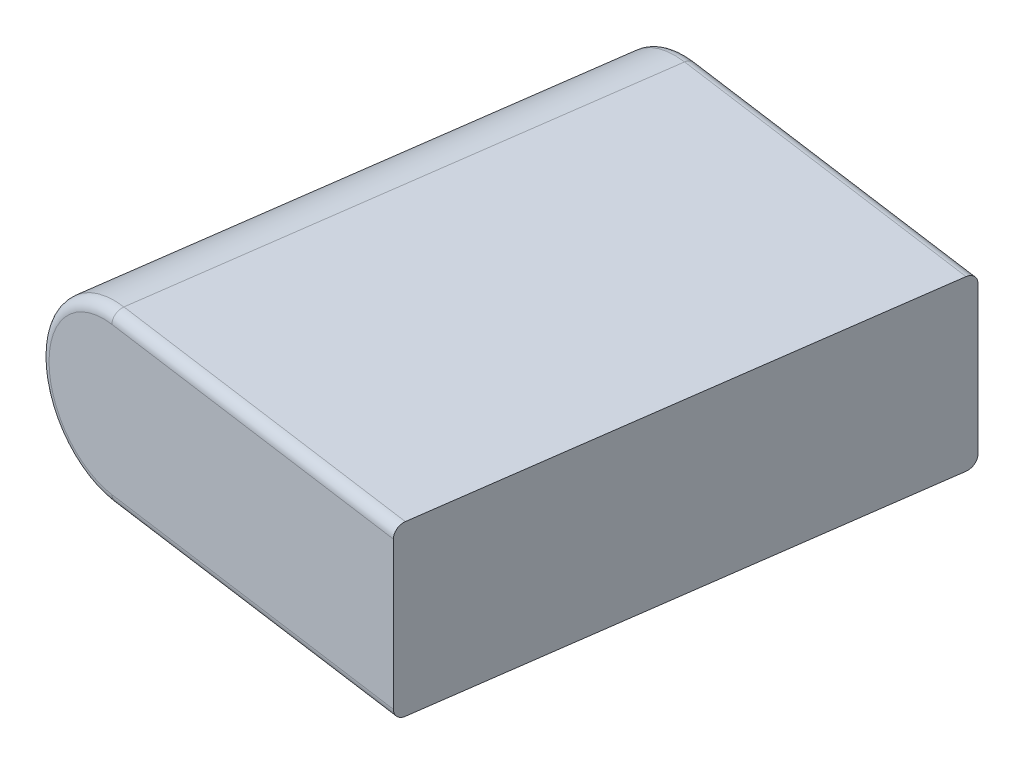
ISO-10303-21;
HEADER;
FILE_DESCRIPTION(('STEP AP214'),'2;1');
FILE_NAME('part.step','',(''),(''),'','','');
FILE_SCHEMA(('AUTOMOTIVE_DESIGN { 1 0 10303 214 1 1 1 1 }'));
ENDSEC;
DATA;
#1=APPLICATION_CONTEXT('core data for automotive mechanical design processes');
#2=APPLICATION_PROTOCOL_DEFINITION('international standard','automotive_design',2000,#1);
#3=PRODUCT_CONTEXT('',#1,'mechanical');
#4=PRODUCT('Part','Part','',(#3));
#5=PRODUCT_RELATED_PRODUCT_CATEGORY('part','',(#4));
#6=PRODUCT_DEFINITION_FORMATION('','',#4);
#7=PRODUCT_DEFINITION_CONTEXT('part definition',#1,'design');
#8=PRODUCT_DEFINITION('design','',#6,#7);
#9=PRODUCT_DEFINITION_SHAPE('','',#8);
#10=(LENGTH_UNIT() NAMED_UNIT(*) SI_UNIT(.MILLI.,.METRE.));
#11=(NAMED_UNIT(*) PLANE_ANGLE_UNIT() SI_UNIT($,.RADIAN.));
#12=(NAMED_UNIT(*) SI_UNIT($,.STERADIAN.) SOLID_ANGLE_UNIT());
#13=UNCERTAINTY_MEASURE_WITH_UNIT(LENGTH_MEASURE(1.E-05),#10,'distance_accuracy_value','');
#14=(GEOMETRIC_REPRESENTATION_CONTEXT(3) GLOBAL_UNCERTAINTY_ASSIGNED_CONTEXT((#13)) GLOBAL_UNIT_ASSIGNED_CONTEXT((#10,
#11,#12)) REPRESENTATION_CONTEXT('',''));
#15=CARTESIAN_POINT('',(0.,0.,0.));
#16=DIRECTION('',(0.,0.,1.));
#17=DIRECTION('',(1.,0.,0.));
#18=AXIS2_PLACEMENT_3D('',#15,#16,#17);
#19=CARTESIAN_POINT('',(-23.6183842047711,0.5,-5.18812243228508));
#20=DIRECTION('',(0.990563834972414,0.,0.137052139146913));
#21=DIRECTION('',(0.,-1.,0.));
#22=AXIS2_PLACEMENT_3D('',#19,#20,#21);
#23=PLANE('',#22);
#24=CARTESIAN_POINT('',(-23.6183842047711,0.5,-5.18812243228508));
#25=DIRECTION('',(0.990563834972414,0.,0.137052139146914));
#26=DIRECTION('',(0.137052139146914,0.,-0.990563834972414));
#27=AXIS2_PLACEMENT_3D('',#24,#25,#26);
#28=CIRCLE('',#27,0.5);
#29=CARTESIAN_POINT('',(-23.6183842047711,0.,-5.18812243228508));
#30=VERTEX_POINT('',#29);
#31=CARTESIAN_POINT('',(-23.5498581351976,0.5,-5.68340434977129));
#32=VERTEX_POINT('',#31);
#33=EDGE_CURVE('E337',#30,#32,#28,.T.);
#34=ORIENTED_EDGE('',*,*,#33,.T.);
#35=DIRECTION('',(0.,1.,0.));
#36=VECTOR('',#35,1.);
#37=CARTESIAN_POINT('',(-23.5498581351976,0.5,-5.68340434977129));
#38=LINE('',#37,#36);
#39=CARTESIAN_POINT('',(-23.5498581351976,7.4375,-5.68340434977129));
#40=VERTEX_POINT('',#39);
#41=EDGE_CURVE('E303',#32,#40,#38,.T.);
#42=ORIENTED_EDGE('',*,*,#41,.T.);
#43=CARTESIAN_POINT('',(-23.6183842047711,7.4375,-5.18812243228508));
#44=DIRECTION('',(0.990563834972414,0.,0.137052139146914));
#45=DIRECTION('',(0.137052139146914,0.,-0.990563834972414));
#46=AXIS2_PLACEMENT_3D('',#43,#44,#45);
#47=CIRCLE('',#46,0.5);
#48=CARTESIAN_POINT('',(-23.6183842047711,7.9375,-5.18812243228508));
#49=VERTEX_POINT('',#48);
#50=EDGE_CURVE('E288',#40,#49,#47,.T.);
#51=ORIENTED_EDGE('',*,*,#50,.T.);
#52=DIRECTION('',(-0.137052139146913,0.,0.990563834972414));
#53=VECTOR('',#52,1.);
#54=CARTESIAN_POINT('',(-23.6183842047711,7.9375,-5.18812243228508));
#55=LINE('',#54,#53);
#56=CARTESIAN_POINT('',(-26.8254042608089,7.9375,17.9910713060695));
#57=VERTEX_POINT('',#56);
#58=EDGE_CURVE('E251',#49,#57,#55,.T.);
#59=ORIENTED_EDGE('',*,*,#58,.T.);
#60=CARTESIAN_POINT('',(-26.8254042608089,7.4375,17.9910713060695));
#61=DIRECTION('',(0.990563834972413,0.,0.137052139146915));
#62=DIRECTION('',(0.137052139146915,0.,-0.990563834972413));
#63=AXIS2_PLACEMENT_3D('',#60,#61,#62);
#64=CIRCLE('',#63,0.5);
#65=CARTESIAN_POINT('',(-26.8939303303823,7.4375,18.4863532235556));
#66=VERTEX_POINT('',#65);
#67=EDGE_CURVE('E230',#57,#66,#64,.T.);
#68=ORIENTED_EDGE('',*,*,#67,.T.);
#69=DIRECTION('',(0.,-1.,0.));
#70=VECTOR('',#69,1.);
#71=CARTESIAN_POINT('',(-26.8939303303823,7.4375,18.4863532235556));
#72=LINE('',#71,#70);
#73=CARTESIAN_POINT('',(-26.8939303303823,0.5,18.4863532235556));
#74=VERTEX_POINT('',#73);
#75=EDGE_CURVE('E341',#66,#74,#72,.T.);
#76=ORIENTED_EDGE('',*,*,#75,.T.);
#77=CARTESIAN_POINT('',(-26.8254042608089,0.5,17.9910713060695));
#78=DIRECTION('',(0.990563834972413,0.,0.137052139146915));
#79=DIRECTION('',(0.137052139146915,0.,-0.990563834972413));
#80=AXIS2_PLACEMENT_3D('',#77,#78,#79);
#81=CIRCLE('',#80,0.5);
#82=CARTESIAN_POINT('',(-26.8254042608089,0.,17.9910713060695));
#83=VERTEX_POINT('',#82);
#84=EDGE_CURVE('E285',#74,#83,#81,.T.);
#85=ORIENTED_EDGE('',*,*,#84,.T.);
#86=DIRECTION('',(0.137052139146913,0.,-0.990563834972414));
#87=VECTOR('',#86,1.);
#88=CARTESIAN_POINT('',(-26.8254042608089,0.,17.9910713060695));
#89=LINE('',#88,#87);
#90=EDGE_CURVE('E263',#83,#30,#89,.T.);
#91=ORIENTED_EDGE('',*,*,#90,.T.);
#92=EDGE_LOOP('',(#34,#42,#51,#59,#68,#76,#85,#91));
#93=FACE_BOUND('',#92,.T.);
#94=ADVANCED_FACE('F47',(#93),#23,.T.);
#95=CARTESIAN_POINT('',(-4.5459657709428,16.7003708587668,0.782129596172916));
#96=DIRECTION('',(0.252147773208521,-0.967059680936466,0.034886587294317));
#97=DIRECTION('',(0.,-0.0360514551812314,-0.999349934997404));
#98=AXIS2_PLACEMENT_3D('',#95,#96,#97);
#99=PLANE('',#98);
#100=DIRECTION('',(-0.957934346195625,-0.254549746625409,-0.132537597955074));
#101=VECTOR('',#100,1.);
#102=CARTESIAN_POINT('',(-4.02516764218453,16.7003708587668,-2.98201297672226));
#103=LINE('',#102,#101);
#104=CARTESIAN_POINT('',(-39.1522140369657,7.36613955679772,-7.84211050940848));
#105=VERTEX_POINT('',#104);
#106=CARTESIAN_POINT('',(-40.3827029841627,7.03916448697172,-8.01235813652347));
#107=VERTEX_POINT('',#106);
#108=EDGE_CURVE('E291',#105,#107,#103,.T.);
#109=ORIENTED_EDGE('',*,*,#108,.F.);
#110=DIRECTION('',(0.137052139146913,0.,-0.990563834972414));
#111=VECTOR('',#110,1.);
#112=CARTESIAN_POINT('',(-39.6730121657239,7.36613955679772,-4.0779679365133));
#113=LINE('',#112,#111);
#114=CARTESIAN_POINT('',(-39.6730121657239,7.36613955679772,-4.0779679365133));
#115=VERTEX_POINT('',#114);
#116=EDGE_CURVE('E11',#115,#105,#113,.T.);
#117=ORIENTED_EDGE('',*,*,#116,.F.);
#118=DIRECTION('',(-0.957934346195625,-0.254549746625409,-0.132537597955074));
#119=VECTOR('',#118,1.);
#120=CARTESIAN_POINT('',(-4.5459657709428,16.7003708587668,0.782129596172916));
#121=LINE('',#120,#119);
#122=CARTESIAN_POINT('',(-40.903501112921,7.03916448697172,-4.2482155636283));
#123=VERTEX_POINT('',#122);
#124=EDGE_CURVE('E320',#115,#123,#121,.T.);
#125=ORIENTED_EDGE('',*,*,#124,.T.);
#126=DIRECTION('',(0.137052139146913,0.,-0.990563834972414));
#127=VECTOR('',#126,1.);
#128=CARTESIAN_POINT('',(-40.903501112921,7.03916448697172,-4.2482155636283));
#129=LINE('',#128,#127);
#130=EDGE_CURVE('E374',#123,#107,#129,.T.);
#131=ORIENTED_EDGE('',*,*,#130,.T.);
#132=EDGE_LOOP('',(#109,#117,#125,#131));
#133=FACE_BOUND('',#132,.T.);
#134=ADVANCED_FACE('F414',(#133),#99,.T.);
#135=CARTESIAN_POINT('',(0.0916153291743967,2.23783216657708,1.42377467526674));
#136=DIRECTION('',(0.125524019638068,0.99193855672924,0.0173672153155031));
#137=DIRECTION('',(0.137052139146913,0.,-0.990563834972414));
#138=AXIS2_PLACEMENT_3D('',#135,#136,#137);
#139=PLANE('',#138);
#140=DIRECTION('',(0.982578460810717,-0.126719768283852,0.135947301102044));
#141=VECTOR('',#140,1.);
#142=CARTESIAN_POINT('',(0.612413457932667,2.23783216657708,-2.34036789762843));
#143=LINE('',#142,#141);
#144=CARTESIAN_POINT('',(-25.5413305666348,5.61079067801632,-5.95893990552694));
#145=VERTEX_POINT('',#144);
#146=EDGE_CURVE('E267',#105,#145,#143,.T.);
#147=ORIENTED_EDGE('',*,*,#146,.T.);
#148=DIRECTION('',(0.137052139146913,0.,-0.990563834972414));
#149=VECTOR('',#148,1.);
#150=CARTESIAN_POINT('',(-26.0621286953931,5.61079067801632,-2.19479733263177));
#151=LINE('',#150,#149);
#152=CARTESIAN_POINT('',(-26.0621286953931,5.61079067801632,-2.19479733263177));
#153=VERTEX_POINT('',#152);
#154=EDGE_CURVE('E50',#153,#145,#151,.T.);
#155=ORIENTED_EDGE('',*,*,#154,.F.);
#156=DIRECTION('',(0.982578460810717,-0.126719768283852,0.135947301102044));
#157=VECTOR('',#156,1.);
#158=CARTESIAN_POINT('',(0.0916153291743967,2.23783216657708,1.42377467526674));
#159=LINE('',#158,#157);
#160=EDGE_CURVE('E315',#115,#153,#159,.T.);
#161=ORIENTED_EDGE('',*,*,#160,.F.);
#162=ORIENTED_EDGE('',*,*,#116,.T.);
#163=EDGE_LOOP('',(#147,#155,#161,#162));
#164=FACE_BOUND('',#163,.T.);
#165=ADVANCED_FACE('F401',(#164),#139,.F.);
#166=CARTESIAN_POINT('',(-29.7403464861843,3.96875000000007,-2.70370710571086));
#167=DIRECTION('',(0.137052139146913,0.,-0.990563834972414));
#168=DIRECTION('',(-0.990563834972414,0.,-0.137052139146913));
#169=AXIS2_PLACEMENT_3D('',#166,#167,#168);
#170=CYLINDRICAL_SURFACE('',#169,4.06011980880961);
#171=CARTESIAN_POINT('',(-29.2195483574259,3.96875000000007,-6.46784967860603));
#172=DIRECTION('',(0.137052139146913,0.,-0.990563834972414));
#173=DIRECTION('',(-0.990563834972414,0.,-0.137052139146913));
#174=AXIS2_PLACEMENT_3D('',#171,#172,#173);
#175=CIRCLE('',#174,4.06011980880961);
#176=CARTESIAN_POINT('',(-25.5413305666348,2.32670932198384,-5.95893990552694));
#177=VERTEX_POINT('',#176);
#178=EDGE_CURVE('E271',#145,#177,#175,.T.);
#179=ORIENTED_EDGE('',*,*,#178,.T.);
#180=DIRECTION('',(0.137052139146913,0.,-0.990563834972414));
#181=VECTOR('',#180,1.);
#182=CARTESIAN_POINT('',(-26.0621286953931,2.32670932198384,-2.19479733263177));
#183=LINE('',#182,#181);
#184=CARTESIAN_POINT('',(-26.0621286953931,2.32670932198384,-2.19479733263177));
#185=VERTEX_POINT('',#184);
#186=EDGE_CURVE('E383',#185,#177,#183,.T.);
#187=ORIENTED_EDGE('',*,*,#186,.F.);
#188=CARTESIAN_POINT('',(-29.7403464861843,3.96875000000007,-2.70370710571086));
#189=DIRECTION('',(0.137052139146913,0.,-0.990563834972414));
#190=DIRECTION('',(-0.990563834972414,0.,-0.137052139146913));
#191=AXIS2_PLACEMENT_3D('',#188,#189,#190);
#192=CIRCLE('',#191,4.06011980880961);
#193=EDGE_CURVE('E319',#153,#185,#192,.T.);
#194=ORIENTED_EDGE('',*,*,#193,.F.);
#195=ORIENTED_EDGE('',*,*,#154,.T.);
#196=EDGE_LOOP('',(#179,#187,#194,#195));
#197=FACE_BOUND('',#196,.T.);
#198=ADVANCED_FACE('F395',(#197),#170,.F.);
#199=CARTESIAN_POINT('',(-0.896699582643063,5.57220825476139,1.28703369196691));
#200=DIRECTION('',(0.125524019638068,-0.99193855672924,0.0173672153155031));
#201=DIRECTION('',(0.,-0.0175056750379174,-0.999846763930087));
#202=AXIS2_PLACEMENT_3D('',#199,#200,#201);
#203=PLANE('',#202);
#204=DIRECTION('',(-0.982578460810717,-0.126719768283852,-0.135947301102044));
#205=VECTOR('',#204,1.);
#206=CARTESIAN_POINT('',(-0.375901453884792,5.57220825476139,-2.47710888092826));
#207=LINE('',#206,#205);
#208=CARTESIAN_POINT('',(-39.1522140369657,0.571360443202432,-7.84211050940848));
#209=VERTEX_POINT('',#208);
#210=EDGE_CURVE('E275',#177,#209,#207,.T.);
#211=ORIENTED_EDGE('',*,*,#210,.T.);
#212=DIRECTION('',(0.137052139146913,0.,-0.990563834972414));
#213=VECTOR('',#212,1.);
#214=CARTESIAN_POINT('',(-39.6730121657239,0.571360443202432,-4.07796793651331));
#215=LINE('',#214,#213);
#216=CARTESIAN_POINT('',(-39.6730121657239,0.571360443202432,-4.07796793651331));
#217=VERTEX_POINT('',#216);
#218=EDGE_CURVE('E381',#217,#209,#215,.T.);
#219=ORIENTED_EDGE('',*,*,#218,.F.);
#220=DIRECTION('',(-0.982578460810717,-0.126719768283852,-0.135947301102044));
#221=VECTOR('',#220,1.);
#222=CARTESIAN_POINT('',(-0.896699582643063,5.57220825476139,1.28703369196691));
#223=LINE('',#222,#221);
#224=EDGE_CURVE('E283',#185,#217,#223,.T.);
#225=ORIENTED_EDGE('',*,*,#224,.F.);
#226=ORIENTED_EDGE('',*,*,#186,.T.);
#227=EDGE_LOOP('',(#211,#219,#225,#226));
#228=FACE_BOUND('',#227,.T.);
#229=ADVANCED_FACE('F407',(#228),#203,.F.);
#230=CARTESIAN_POINT('',(-2.61047033164901,-9.27718572347895,1.04992030374674));
#231=DIRECTION('',(-0.25214777320852,-0.967059680936467,-0.0348865872943169));
#232=DIRECTION('',(-0.967648710244236,0.252301354658803,0.));
#233=AXIS2_PLACEMENT_3D('',#230,#231,#232);
#234=PLANE('',#233);
#235=DIRECTION('',(-0.957934346195625,0.254549746625408,-0.132537597955074));
#236=VECTOR('',#235,1.);
#237=CARTESIAN_POINT('',(-2.08967220289074,-9.27718572347895,-2.71422226914843));
#238=LINE('',#237,#236);
#239=CARTESIAN_POINT('',(-40.3827029841627,0.898335513028433,-8.01235813652347));
#240=VERTEX_POINT('',#239);
#241=EDGE_CURVE('E272',#209,#240,#238,.T.);
#242=ORIENTED_EDGE('',*,*,#241,.T.);
#243=DIRECTION('',(0.137052139146913,0.,-0.990563834972414));
#244=VECTOR('',#243,1.);
#245=CARTESIAN_POINT('',(-40.903501112921,0.898335513028433,-4.2482155636283));
#246=LINE('',#245,#244);
#247=CARTESIAN_POINT('',(-40.903501112921,0.898335513028433,-4.2482155636283));
#248=VERTEX_POINT('',#247);
#249=EDGE_CURVE('E79',#248,#240,#246,.T.);
#250=ORIENTED_EDGE('',*,*,#249,.F.);
#251=DIRECTION('',(-0.957934346195625,0.254549746625408,-0.132537597955074));
#252=VECTOR('',#251,1.);
#253=CARTESIAN_POINT('',(-2.61047033164901,-9.27718572347895,1.04992030374674));
#254=LINE('',#253,#252);
#255=EDGE_CURVE('E279',#217,#248,#254,.T.);
#256=ORIENTED_EDGE('',*,*,#255,.F.);
#257=ORIENTED_EDGE('',*,*,#218,.T.);
#258=EDGE_LOOP('',(#242,#250,#256,#257));
#259=FACE_BOUND('',#258,.T.);
#260=ADVANCED_FACE('F408',(#259),#234,.F.);
#261=CARTESIAN_POINT('',(-40.1029319329843,3.96875000000007,-4.1374506489689));
#262=DIRECTION('',(0.137052139146913,0.,-0.990563834972414));
#263=DIRECTION('',(-0.990563834972414,0.,-0.137052139146913));
#264=AXIS2_PLACEMENT_3D('',#261,#262,#263);
#265=CYLINDRICAL_SURFACE('',#264,3.17499999999661);
#266=CARTESIAN_POINT('',(-39.5821338042261,3.96875000000007,-7.90159322186408));
#267=DIRECTION('',(0.137052139146913,0.,-0.990563834972414));
#268=DIRECTION('',(-0.990563834972414,0.,-0.137052139146913));
#269=AXIS2_PLACEMENT_3D('',#266,#267,#268);
#270=CIRCLE('',#269,3.17499999999661);
#271=CARTESIAN_POINT('',(-40.7016128182956,1.00169737578043,-8.0564817693675));
#272=VERTEX_POINT('',#271);
#273=EDGE_CURVE('E276',#240,#272,#270,.T.);
#274=ORIENTED_EDGE('',*,*,#273,.T.);
#275=DIRECTION('',(0.137052139146913,0.,-0.990563834972414));
#276=VECTOR('',#275,1.);
#277=CARTESIAN_POINT('',(-41.2224109470539,1.00169737578043,-4.29233919647234));
#278=LINE('',#277,#276);
#279=CARTESIAN_POINT('',(-41.2224109470539,1.00169737578043,-4.29233919647234));
#280=VERTEX_POINT('',#279);
#281=EDGE_CURVE('E68',#280,#272,#278,.T.);
#282=ORIENTED_EDGE('',*,*,#281,.F.);
#283=CARTESIAN_POINT('',(-40.1029319329843,3.96875000000007,-4.1374506489689));
#284=DIRECTION('',(0.137052139146913,0.,-0.990563834972414));
#285=DIRECTION('',(-0.990563834972414,0.,-0.137052139146913));
#286=AXIS2_PLACEMENT_3D('',#283,#284,#285);
#287=CIRCLE('',#286,3.17499999999661);
#288=EDGE_CURVE('E282',#248,#280,#287,.T.);
#289=ORIENTED_EDGE('',*,*,#288,.F.);
#290=ORIENTED_EDGE('',*,*,#249,.T.);
#291=EDGE_LOOP('',(#274,#282,#289,#290));
#292=FACE_BOUND('',#291,.T.);
#293=ADVANCED_FACE('F519',(#292),#265,.F.);
#294=CARTESIAN_POINT('',(-39.4424734960165,3.96875,-4.04607113519271));
#295=DIRECTION('',(0.137052139146913,0.,-0.990563834972414));
#296=DIRECTION('',(-0.990563834972414,0.,-0.137052139146913));
#297=AXIS2_PLACEMENT_3D('',#294,#295,#296);
#298=CYLINDRICAL_SURFACE('',#297,3.46875);
#299=DIRECTION('',(0.137052139146913,0.,-0.990563834972414));
#300=VECTOR('',#299,1.);
#301=CARTESIAN_POINT('',(-42.8784917985771,3.96875,-4.52147074285856));
#302=LINE('',#301,#300);
#303=CARTESIAN_POINT('',(-42.8784917985771,3.96875,-4.52147074285856));
#304=VERTEX_POINT('',#303);
#305=CARTESIAN_POINT('',(-42.3576936698188,3.96875,-8.28561331575373));
#306=VERTEX_POINT('',#305);
#307=EDGE_CURVE('E434',#304,#306,#302,.T.);
#308=ORIENTED_EDGE('',*,*,#307,.F.);
#309=CARTESIAN_POINT('',(-39.4424734960165,3.96875,-4.04607113519271));
#310=DIRECTION('',(0.137052139146913,0.,-0.990563834972414));
#311=DIRECTION('',(-0.990563834972414,0.,-0.137052139146913));
#312=AXIS2_PLACEMENT_3D('',#309,#310,#311);
#313=CIRCLE('',#312,3.46875);
#314=EDGE_CURVE('E371',#280,#304,#313,.T.);
#315=ORIENTED_EDGE('',*,*,#314,.F.);
#316=ORIENTED_EDGE('',*,*,#281,.T.);
#317=CARTESIAN_POINT('',(-38.9216753672582,3.96875,-7.81021370808788));
#318=DIRECTION('',(0.137052139146913,0.,-0.990563834972414));
#319=DIRECTION('',(-0.990563834972414,0.,-0.137052139146913));
#320=AXIS2_PLACEMENT_3D('',#317,#318,#319);
#321=CIRCLE('',#320,3.46875);
#322=EDGE_CURVE('E354',#272,#306,#321,.T.);
#323=ORIENTED_EDGE('',*,*,#322,.T.);
#324=EDGE_LOOP('',(#308,#315,#316,#323));
#325=FACE_BOUND('',#324,.T.);
#326=ADVANCED_FACE('F522',(#325),#298,.F.);
#327=CARTESIAN_POINT('',(-40.1029319329843,3.96875000000007,-4.1374506489689));
#328=DIRECTION('',(0.137052139146913,0.,-0.990563834972414));
#329=DIRECTION('',(-0.990563834972414,0.,-0.137052139146913));
#330=AXIS2_PLACEMENT_3D('',#327,#328,#329);
#331=CYLINDRICAL_SURFACE('',#330,3.17499999999661);
#332=CARTESIAN_POINT('',(-39.5821338042261,3.96875000000007,-7.90159322186408));
#333=DIRECTION('',(0.137052139146913,0.,-0.990563834972414));
#334=DIRECTION('',(-0.990563834972414,0.,-0.137052139146913));
#335=AXIS2_PLACEMENT_3D('',#332,#333,#334);
#336=CIRCLE('',#335,3.17499999999661);
#337=CARTESIAN_POINT('',(-40.7016128182949,6.93580262421998,-8.05648176936742));
#338=VERTEX_POINT('',#337);
#339=EDGE_CURVE('E295',#338,#107,#336,.T.);
#340=ORIENTED_EDGE('',*,*,#339,.T.);
#341=ORIENTED_EDGE('',*,*,#130,.F.);
#342=CARTESIAN_POINT('',(-40.1029319329843,3.96875000000007,-4.1374506489689));
#343=DIRECTION('',(0.137052139146913,0.,-0.990563834972414));
#344=DIRECTION('',(-0.990563834972414,0.,-0.137052139146913));
#345=AXIS2_PLACEMENT_3D('',#342,#343,#344);
#346=CIRCLE('',#345,3.17499999999661);
#347=CARTESIAN_POINT('',(-41.2224109470532,6.93580262421998,-4.29233919647224));
#348=VERTEX_POINT('',#347);
#349=EDGE_CURVE('E336',#348,#123,#346,.T.);
#350=ORIENTED_EDGE('',*,*,#349,.F.);
#351=DIRECTION('',(0.137052139146913,0.,-0.990563834972414));
#352=VECTOR('',#351,1.);
#353=CARTESIAN_POINT('',(-41.2224109470532,6.93580262421998,-4.29233919647224));
#354=LINE('',#353,#352);
#355=EDGE_CURVE('E421',#348,#338,#354,.T.);
#356=ORIENTED_EDGE('',*,*,#355,.T.);
#357=EDGE_LOOP('',(#340,#341,#350,#356));
#358=FACE_BOUND('',#357,.T.);
#359=ADVANCED_FACE('F423',(#358),#331,.F.);
#360=CARTESIAN_POINT('',(-0.191569235956684,0.,1.38459390866255));
#361=DIRECTION('',(0.137052139146913,0.,-0.990563834972414));
#362=DIRECTION('',(0.,-1.,0.));
#363=AXIS2_PLACEMENT_3D('',#360,#361,#362);
#364=PLANE('',#363);
#365=ORIENTED_EDGE('',*,*,#349,.T.);
#366=ORIENTED_EDGE('',*,*,#124,.F.);
#367=ORIENTED_EDGE('',*,*,#160,.T.);
#368=ORIENTED_EDGE('',*,*,#193,.T.);
#369=ORIENTED_EDGE('',*,*,#224,.T.);
#370=ORIENTED_EDGE('',*,*,#255,.T.);
#371=ORIENTED_EDGE('',*,*,#288,.T.);
#372=ORIENTED_EDGE('',*,*,#314,.T.);
#373=CARTESIAN_POINT('',(-39.4424734960165,3.96875,-4.04607113519271));
#374=DIRECTION('',(0.137052139146913,0.,-0.990563834972414));
#375=DIRECTION('',(-0.990563834972414,0.,-0.137052139146913));
#376=AXIS2_PLACEMENT_3D('',#373,#374,#375);
#377=CIRCLE('',#376,3.46875);
#378=EDGE_CURVE('E443',#304,#348,#377,.T.);
#379=ORIENTED_EDGE('',*,*,#378,.T.);
#380=EDGE_LOOP('',(#365,#366,#367,#368,#369,#370,#371,#372,#379));
#381=FACE_BOUND('',#380,.T.);
#382=ADVANCED_FACE('F410',(#381),#364,.T.);
#383=CARTESIAN_POINT('',(-42.9215016568785,0.5,-7.85885746784098));
#384=DIRECTION('',(0.990563834972414,0.,0.137052139146915));
#385=DIRECTION('',(0.137052139146915,0.,-0.990563834972414));
#386=AXIS2_PLACEMENT_3D('',#383,#384,#385);
#387=CYLINDRICAL_SURFACE('',#386,0.5);
#388=DIRECTION('',(-0.990563834972414,0.,-0.137052139146913));
#389=VECTOR('',#388,1.);
#390=CARTESIAN_POINT('',(-38.9216753672582,0.5,-7.81021370808787));
#391=LINE('',#390,#389);
#392=CARTESIAN_POINT('',(-38.9216753672582,0.5,-7.81021370808787));
#393=VERTEX_POINT('',#392);
#394=EDGE_CURVE('E308',#32,#393,#391,.T.);
#395=ORIENTED_EDGE('',*,*,#394,.F.);
#396=ORIENTED_EDGE('',*,*,#33,.F.);
#397=DIRECTION('',(0.990563834972414,0.,0.137052139146913));
#398=VECTOR('',#397,1.);
#399=CARTESIAN_POINT('',(-24.2493733676485,0.,-5.27542464492166));
#400=LINE('',#399,#398);
#401=CARTESIAN_POINT('',(-38.9902014368318,0.,-7.31493179060167));
#402=VERTEX_POINT('',#401);
#403=EDGE_CURVE('E462',#402,#30,#400,.T.);
#404=ORIENTED_EDGE('',*,*,#403,.F.);
#405=CARTESIAN_POINT('',(-38.9902014368318,0.5,-7.31493179060167));
#406=DIRECTION('',(0.990563834972414,0.,0.137052139146915));
#407=DIRECTION('',(0.137052139146915,0.,-0.990563834972414));
#408=AXIS2_PLACEMENT_3D('',#405,#406,#407);
#409=CIRCLE('',#408,0.5);
#410=EDGE_CURVE('E340',#402,#393,#409,.T.);
#411=ORIENTED_EDGE('',*,*,#410,.T.);
#412=EDGE_LOOP('',(#395,#396,#404,#411));
#413=FACE_BOUND('',#412,.T.);
#414=ADVANCED_FACE('F477',(#413),#387,.T.);
#415=CARTESIAN_POINT('',(-38.9902014368318,3.96875,-7.31493179060167));
#416=DIRECTION('',(-0.137052139146913,0.,0.990563834972414));
#417=DIRECTION('',(0.990563834972414,0.,0.137052139146913));
#418=AXIS2_PLACEMENT_3D('',#415,#416,#417);
#419=TOROIDAL_SURFACE('',#418,3.46875,0.5);
#420=CARTESIAN_POINT('',(-38.9902014368318,7.4375,-7.31493179060166));
#421=DIRECTION('',(-0.990563834972414,0.,-0.137052139146915));
#422=DIRECTION('',(-0.137052139146915,0.,0.990563834972414));
#423=AXIS2_PLACEMENT_3D('',#420,#421,#422);
#424=CIRCLE('',#423,0.5);
#425=CARTESIAN_POINT('',(-38.9902014368318,7.9375,-7.31493179060166));
#426=VERTEX_POINT('',#425);
#427=CARTESIAN_POINT('',(-38.9216753672582,7.4375,-7.81021370808787));
#428=VERTEX_POINT('',#427);
#429=EDGE_CURVE('E351',#426,#428,#424,.T.);
#430=ORIENTED_EDGE('',*,*,#429,.T.);
#431=CARTESIAN_POINT('',(-38.9216753672582,3.96875,-7.81021370808787));
#432=DIRECTION('',(0.137052139146913,0.,-0.990563834972414));
#433=DIRECTION('',(0.990563834972414,0.,0.137052139146913));
#434=AXIS2_PLACEMENT_3D('',#431,#432,#433);
#435=CIRCLE('',#434,3.46875);
#436=EDGE_CURVE('E296',#338,#428,#435,.T.);
#437=ORIENTED_EDGE('',*,*,#436,.F.);
#438=CARTESIAN_POINT('',(-38.9216753672582,3.96875,-7.81021370808788));
#439=DIRECTION('',(0.137052139146913,0.,-0.990563834972414));
#440=DIRECTION('',(-0.990563834972414,0.,-0.137052139146913));
#441=AXIS2_PLACEMENT_3D('',#438,#439,#440);
#442=CIRCLE('',#441,3.46875);
#443=EDGE_CURVE('E428',#306,#338,#442,.T.);
#444=ORIENTED_EDGE('',*,*,#443,.F.);
#445=ORIENTED_EDGE('',*,*,#322,.F.);
#446=CARTESIAN_POINT('',(-38.9216753672582,3.96875,-7.81021370808787));
#447=DIRECTION('',(0.137052139146913,0.,-0.990563834972414));
#448=DIRECTION('',(0.990563834972414,0.,0.137052139146913));
#449=AXIS2_PLACEMENT_3D('',#446,#447,#448);
#450=CIRCLE('',#449,3.46875);
#451=EDGE_CURVE('E309',#393,#272,#450,.T.);
#452=ORIENTED_EDGE('',*,*,#451,.F.);
#453=ORIENTED_EDGE('',*,*,#410,.F.);
#454=CARTESIAN_POINT('',(-38.9902014368318,3.96875,-7.31493179060167));
#455=DIRECTION('',(-0.137052139146913,0.,0.990563834972414));
#456=DIRECTION('',(0.990563834972414,0.,0.137052139146913));
#457=AXIS2_PLACEMENT_3D('',#454,#455,#456);
#458=CIRCLE('',#457,3.96875);
#459=CARTESIAN_POINT('',(-42.9215016568785,3.96875,-7.85885746784098));
#460=VERTEX_POINT('',#459);
#461=EDGE_CURVE('E454',#460,#402,#458,.T.);
#462=ORIENTED_EDGE('',*,*,#461,.F.);
#463=CARTESIAN_POINT('',(-38.9902014368318,3.96875,-7.31493179060167));
#464=DIRECTION('',(-0.137052139146913,0.,0.990563834972414));
#465=DIRECTION('',(0.990563834972414,0.,0.137052139146913));
#466=AXIS2_PLACEMENT_3D('',#463,#464,#465);
#467=CIRCLE('',#466,3.96875);
#468=EDGE_CURVE('E241',#426,#460,#467,.T.);
#469=ORIENTED_EDGE('',*,*,#468,.F.);
#470=EDGE_LOOP('',(#430,#437,#444,#445,#452,#453,#462,#469));
#471=FACE_BOUND('',#470,.T.);
#472=ADVANCED_FACE('F528',(#471),#419,.T.);
#473=CARTESIAN_POINT('',(0.260702823228129,7.4375,-1.88426674674641));
#474=DIRECTION('',(-0.990563834972414,0.,-0.137052139146913));
#475=DIRECTION('',(-0.137052139146913,0.,0.990563834972414));
#476=AXIS2_PLACEMENT_3D('',#473,#474,#475);
#477=CYLINDRICAL_SURFACE('',#476,0.5);
#478=DIRECTION('',(-0.990563834972414,0.,-0.137052139146913));
#479=VECTOR('',#478,1.);
#480=CARTESIAN_POINT('',(0.260702823228129,7.9375,-1.88426674674641));
#481=LINE('',#480,#479);
#482=EDGE_CURVE('E242',#49,#426,#481,.T.);
#483=ORIENTED_EDGE('',*,*,#482,.F.);
#484=ORIENTED_EDGE('',*,*,#50,.F.);
#485=DIRECTION('',(0.990563834972414,0.,0.137052139146913));
#486=VECTOR('',#485,1.);
#487=CARTESIAN_POINT('',(-42.8529755873051,7.4375,-8.35413938532718));
#488=LINE('',#487,#486);
#489=EDGE_CURVE('E300',#428,#40,#488,.T.);
#490=ORIENTED_EDGE('',*,*,#489,.F.);
#491=ORIENTED_EDGE('',*,*,#429,.F.);
#492=EDGE_LOOP('',(#483,#484,#490,#491));
#493=FACE_BOUND('',#492,.T.);
#494=ADVANCED_FACE('F531',(#493),#477,.T.);
#495=CARTESIAN_POINT('',(-42.1972214928695,0.5,15.8642619477528));
#496=DIRECTION('',(0.990563834972414,0.,0.137052139146915));
#497=DIRECTION('',(0.137052139146915,0.,-0.990563834972414));
#498=AXIS2_PLACEMENT_3D('',#495,#496,#497);
#499=CYLINDRICAL_SURFACE('',#498,0.5);
#500=CARTESIAN_POINT('',(-42.1972214928695,0.5,15.8642619477528));
#501=DIRECTION('',(0.990563834972414,0.,0.137052139146915));
#502=DIRECTION('',(0.137052139146915,0.,-0.990563834972414));
#503=AXIS2_PLACEMENT_3D('',#500,#501,#502);
#504=CIRCLE('',#503,0.5);
#505=CARTESIAN_POINT('',(-42.2657475624429,0.5,16.359543865239));
#506=VERTEX_POINT('',#505);
#507=CARTESIAN_POINT('',(-42.1972214928695,0.,15.8642619477528));
#508=VERTEX_POINT('',#507);
#509=EDGE_CURVE('E229',#506,#508,#504,.T.);
#510=ORIENTED_EDGE('',*,*,#509,.T.);
#511=DIRECTION('',(-0.990563834972414,0.,-0.137052139146913));
#512=VECTOR('',#511,1.);
#513=CARTESIAN_POINT('',(-2.94631723280965,0.,21.2949269916081));
#514=LINE('',#513,#512);
#515=EDGE_CURVE('E257',#83,#508,#514,.T.);
#516=ORIENTED_EDGE('',*,*,#515,.F.);
#517=ORIENTED_EDGE('',*,*,#84,.F.);
#518=DIRECTION('',(0.990563834972414,0.,0.137052139146913));
#519=VECTOR('',#518,1.);
#520=CARTESIAN_POINT('',(-42.2657475624429,0.5,16.359543865239));
#521=LINE('',#520,#519);
#522=EDGE_CURVE('E332',#506,#74,#521,.T.);
#523=ORIENTED_EDGE('',*,*,#522,.F.);
#524=EDGE_LOOP('',(#510,#516,#517,#523));
#525=FACE_BOUND('',#524,.T.);
#526=ADVANCED_FACE('F485',(#525),#499,.T.);
#527=CARTESIAN_POINT('',(-42.1972214928695,3.96875,15.8642619477528));
#528=DIRECTION('',(-0.137052139146913,0.,0.990563834972414));
#529=DIRECTION('',(0.990563834972414,0.,0.137052139146913));
#530=AXIS2_PLACEMENT_3D('',#527,#528,#529);
#531=TOROIDAL_SURFACE('',#530,3.46875,0.5);
#532=CARTESIAN_POINT('',(-42.1972214928695,7.4375,15.8642619477528));
#533=DIRECTION('',(-0.990563834972413,0.,-0.137052139146915));
#534=DIRECTION('',(-0.137052139146915,0.,0.990563834972413));
#535=AXIS2_PLACEMENT_3D('',#532,#533,#534);
#536=CIRCLE('',#535,0.5);
#537=CARTESIAN_POINT('',(-42.2657475624429,7.4375,16.359543865239));
#538=VERTEX_POINT('',#537);
#539=CARTESIAN_POINT('',(-42.1972214928695,7.9375,15.8642619477528));
#540=VERTEX_POINT('',#539);
#541=EDGE_CURVE('E216',#538,#540,#536,.T.);
#542=ORIENTED_EDGE('',*,*,#541,.T.);
#543=CARTESIAN_POINT('',(-42.1972214928695,3.96875,15.8642619477528));
#544=DIRECTION('',(0.137052139146914,0.,-0.990563834972414));
#545=DIRECTION('',(0.990563834972414,0.,0.137052139146914));
#546=AXIS2_PLACEMENT_3D('',#543,#544,#545);
#547=CIRCLE('',#546,3.96875);
#548=CARTESIAN_POINT('',(-46.1285217129163,3.96875,15.3203362705135));
#549=VERTEX_POINT('',#548);
#550=EDGE_CURVE('E220',#549,#540,#547,.T.);
#551=ORIENTED_EDGE('',*,*,#550,.F.);
#552=CARTESIAN_POINT('',(-42.1972214928695,3.96875,15.8642619477528));
#553=DIRECTION('',(0.137052139146914,0.,-0.990563834972414));
#554=DIRECTION('',(0.990563834972414,0.,0.137052139146914));
#555=AXIS2_PLACEMENT_3D('',#552,#553,#554);
#556=CIRCLE('',#555,3.96875);
#557=EDGE_CURVE('E427',#508,#549,#556,.T.);
#558=ORIENTED_EDGE('',*,*,#557,.F.);
#559=ORIENTED_EDGE('',*,*,#509,.F.);
#560=CARTESIAN_POINT('',(-42.2657475624429,3.96875,16.359543865239));
#561=DIRECTION('',(-0.137052139146914,0.,0.990563834972414));
#562=DIRECTION('',(0.990563834972414,0.,0.137052139146914));
#563=AXIS2_PLACEMENT_3D('',#560,#561,#562);
#564=CIRCLE('',#563,3.46875);
#565=EDGE_CURVE('E223',#538,#506,#564,.T.);
#566=ORIENTED_EDGE('',*,*,#565,.F.);
#567=EDGE_LOOP('',(#542,#551,#558,#559,#566));
#568=FACE_BOUND('',#567,.T.);
#569=ADVANCED_FACE('F218',(#568),#531,.T.);
#570=CARTESIAN_POINT('',(-42.1972214928695,7.4375,15.8642619477528));
#571=DIRECTION('',(0.990563834972414,0.,0.137052139146915));
#572=DIRECTION('',(0.137052139146915,0.,-0.990563834972414));
#573=AXIS2_PLACEMENT_3D('',#570,#571,#572);
#574=CYLINDRICAL_SURFACE('',#573,0.5);
#575=DIRECTION('',(-0.990563834972414,0.,-0.137052139146913));
#576=VECTOR('',#575,1.);
#577=CARTESIAN_POINT('',(-42.2657475624429,7.4375,16.359543865239));
#578=LINE('',#577,#576);
#579=EDGE_CURVE('E326',#66,#538,#578,.T.);
#580=ORIENTED_EDGE('',*,*,#579,.F.);
#581=ORIENTED_EDGE('',*,*,#67,.F.);
#582=DIRECTION('',(0.990563834972414,0.,0.137052139146913));
#583=VECTOR('',#582,1.);
#584=CARTESIAN_POINT('',(-27.4563934236863,7.9375,17.9037690934329));
#585=LINE('',#584,#583);
#586=EDGE_CURVE('E245',#540,#57,#585,.T.);
#587=ORIENTED_EDGE('',*,*,#586,.F.);
#588=ORIENTED_EDGE('',*,*,#541,.F.);
#589=EDGE_LOOP('',(#580,#581,#587,#588));
#590=FACE_BOUND('',#589,.T.);
#591=ADVANCED_FACE('F246',(#590),#574,.T.);
#592=CARTESIAN_POINT('',(-42.2657475624429,3.96875,16.359543865239));
#593=DIRECTION('',(-0.137052139146913,0.,0.990563834972414));
#594=DIRECTION('',(0.,1.,0.));
#595=AXIS2_PLACEMENT_3D('',#592,#593,#594);
#596=PLANE('',#595);
#597=ORIENTED_EDGE('',*,*,#565,.T.);
#598=ORIENTED_EDGE('',*,*,#522,.T.);
#599=ORIENTED_EDGE('',*,*,#75,.F.);
#600=ORIENTED_EDGE('',*,*,#579,.T.);
#601=EDGE_LOOP('',(#597,#598,#599,#600));
#602=FACE_BOUND('',#601,.T.);
#603=ADVANCED_FACE('F490',(#602),#596,.T.);
#604=CARTESIAN_POINT('',(-42.8529755873051,7.9375,-8.35413938532718));
#605=DIRECTION('',(-0.137052139146913,0.,0.990563834972414));
#606=DIRECTION('',(0.,1.,0.));
#607=AXIS2_PLACEMENT_3D('',#604,#605,#606);
#608=PLANE('',#607);
#609=ORIENTED_EDGE('',*,*,#108,.T.);
#610=ORIENTED_EDGE('',*,*,#339,.F.);
#611=ORIENTED_EDGE('',*,*,#436,.T.);
#612=ORIENTED_EDGE('',*,*,#489,.T.);
#613=ORIENTED_EDGE('',*,*,#41,.F.);
#614=ORIENTED_EDGE('',*,*,#394,.T.);
#615=ORIENTED_EDGE('',*,*,#451,.T.);
#616=ORIENTED_EDGE('',*,*,#273,.F.);
#617=ORIENTED_EDGE('',*,*,#241,.F.);
#618=ORIENTED_EDGE('',*,*,#210,.F.);
#619=ORIENTED_EDGE('',*,*,#178,.F.);
#620=ORIENTED_EDGE('',*,*,#146,.F.);
#621=EDGE_LOOP('',(#609,#610,#611,#612,#613,#614,#615,#616,#617,#618,#619,#620));
#622=FACE_BOUND('',#621,.T.);
#623=ADVANCED_FACE('F404',(#622),#608,.F.);
#624=CARTESIAN_POINT('',(-42.7124080388486,3.96875,19.5878460077152));
#625=DIRECTION('',(0.137052139146913,0.,-0.990563834972414));
#626=DIRECTION('',(-0.990563834972414,0.,-0.137052139146913));
#627=AXIS2_PLACEMENT_3D('',#624,#625,#626);
#628=CYLINDRICAL_SURFACE('',#627,3.96875);
#629=DIRECTION('',(0.137052139146913,0.,-0.990563834972414));
#630=VECTOR('',#629,1.);
#631=CARTESIAN_POINT('',(-46.6437082588953,3.96875,19.0439203304758));
#632=LINE('',#631,#630);
#633=EDGE_CURVE('E238',#549,#460,#632,.T.);
#634=ORIENTED_EDGE('',*,*,#633,.F.);
#635=ORIENTED_EDGE('',*,*,#550,.T.);
#636=DIRECTION('',(0.137052139146913,0.,-0.990563834972414));
#637=VECTOR('',#636,1.);
#638=CARTESIAN_POINT('',(-42.7124080388486,7.9375,19.5878460077152));
#639=LINE('',#638,#637);
#640=EDGE_CURVE('E236',#540,#426,#639,.T.);
#641=ORIENTED_EDGE('',*,*,#640,.T.);
#642=ORIENTED_EDGE('',*,*,#468,.T.);
#643=EDGE_LOOP('',(#634,#635,#641,#642));
#644=FACE_BOUND('',#643,.T.);
#645=ADVANCED_FACE('F234',(#644),#628,.T.);
#646=CARTESIAN_POINT('',(0.,7.9375,0.));
#647=DIRECTION('',(0.,-1.,0.));
#648=DIRECTION('',(0.,0.,-1.));
#649=AXIS2_PLACEMENT_3D('',#646,#647,#648);
#650=PLANE('',#649);
#651=ORIENTED_EDGE('',*,*,#640,.F.);
#652=ORIENTED_EDGE('',*,*,#586,.T.);
#653=ORIENTED_EDGE('',*,*,#58,.F.);
#654=ORIENTED_EDGE('',*,*,#482,.T.);
#655=EDGE_LOOP('',(#651,#652,#653,#654));
#656=FACE_BOUND('',#655,.T.);
#657=ADVANCED_FACE('F254',(#656),#650,.F.);
#658=CARTESIAN_POINT('',(0.,0.,0.));
#659=DIRECTION('',(0.,-1.,0.));
#660=DIRECTION('',(0.,0.,-1.));
#661=AXIS2_PLACEMENT_3D('',#658,#659,#660);
#662=PLANE('',#661);
#663=ORIENTED_EDGE('',*,*,#403,.T.);
#664=ORIENTED_EDGE('',*,*,#90,.F.);
#665=ORIENTED_EDGE('',*,*,#515,.T.);
#666=DIRECTION('',(0.137052139146913,0.,-0.990563834972414));
#667=VECTOR('',#666,1.);
#668=CARTESIAN_POINT('',(-42.7124080388486,0.,19.5878460077152));
#669=LINE('',#668,#667);
#670=EDGE_CURVE('E458',#508,#402,#669,.T.);
#671=ORIENTED_EDGE('',*,*,#670,.T.);
#672=EDGE_LOOP('',(#663,#664,#665,#671));
#673=FACE_BOUND('',#672,.T.);
#674=ADVANCED_FACE('F473',(#673),#662,.T.);
#675=CARTESIAN_POINT('',(-42.7124080388486,3.96875,19.5878460077152));
#676=DIRECTION('',(0.137052139146913,0.,-0.990563834972414));
#677=DIRECTION('',(-0.990563834972414,0.,-0.137052139146913));
#678=AXIS2_PLACEMENT_3D('',#675,#676,#677);
#679=CYLINDRICAL_SURFACE('',#678,3.96875);
#680=ORIENTED_EDGE('',*,*,#557,.T.);
#681=ORIENTED_EDGE('',*,*,#633,.T.);
#682=ORIENTED_EDGE('',*,*,#461,.T.);
#683=ORIENTED_EDGE('',*,*,#670,.F.);
#684=EDGE_LOOP('',(#680,#681,#682,#683));
#685=FACE_BOUND('',#684,.T.);
#686=ADVANCED_FACE('F487',(#685),#679,.T.);
#687=CARTESIAN_POINT('',(-39.4424734960165,3.96875,-4.04607113519271));
#688=DIRECTION('',(0.137052139146913,0.,-0.990563834972414));
#689=DIRECTION('',(-0.990563834972414,0.,-0.137052139146913));
#690=AXIS2_PLACEMENT_3D('',#687,#688,#689);
#691=CYLINDRICAL_SURFACE('',#690,3.46875);
#692=ORIENTED_EDGE('',*,*,#378,.F.);
#693=ORIENTED_EDGE('',*,*,#307,.T.);
#694=ORIENTED_EDGE('',*,*,#443,.T.);
#695=ORIENTED_EDGE('',*,*,#355,.F.);
#696=EDGE_LOOP('',(#692,#693,#694,#695));
#697=FACE_BOUND('',#696,.T.);
#698=ADVANCED_FACE('F432',(#697),#691,.F.);
#699=CLOSED_SHELL('',(#94,#134,#165,#198,#229,#260,#293,#326,#359,#382,#414,#472,#494,#526,#569,
#591,#603,#623,#645,#657,#674,#686,#698));
#700=MANIFOLD_SOLID_BREP('B2',#699);
#701=ADVANCED_BREP_SHAPE_REPRESENTATION('',(#18,#700),#14);
#702=SHAPE_DEFINITION_REPRESENTATION(#9,#701);
ENDSEC;
END-ISO-10303-21;
